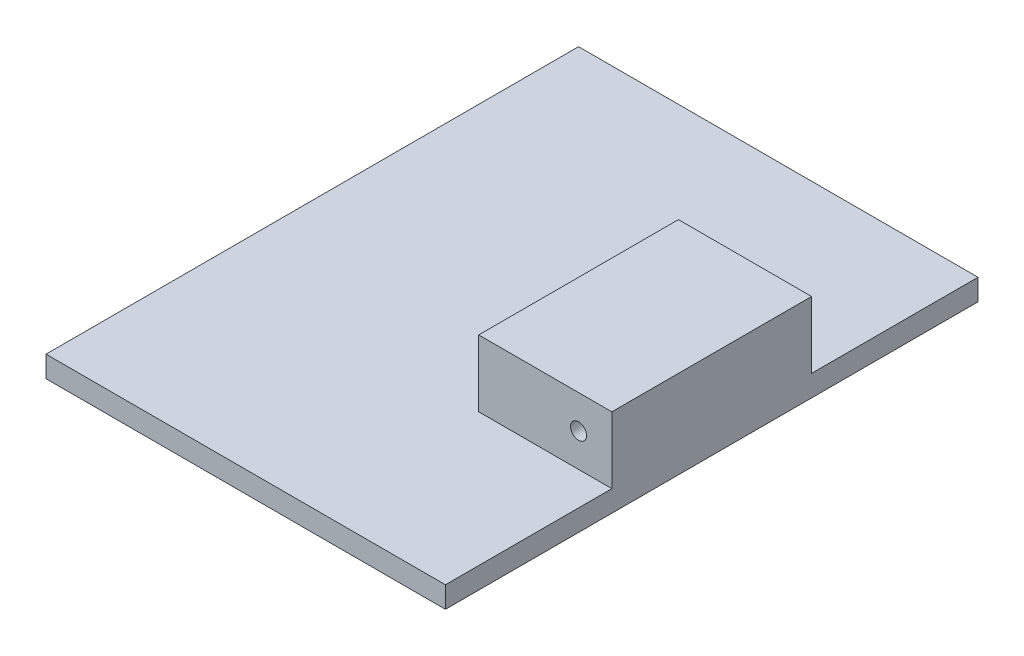
ISO-10303-21;
HEADER;
FILE_DESCRIPTION(('STEP AP214'),'2;1');
FILE_NAME('part.step','',(''),(''),'','','');
FILE_SCHEMA(('AUTOMOTIVE_DESIGN { 1 0 10303 214 1 1 1 1 }'));
ENDSEC;
DATA;
#1=APPLICATION_CONTEXT('core data for automotive mechanical design processes');
#2=APPLICATION_PROTOCOL_DEFINITION('international standard','automotive_design',2000,#1);
#3=PRODUCT_CONTEXT('',#1,'mechanical');
#4=PRODUCT('Part','Part','',(#3));
#5=PRODUCT_RELATED_PRODUCT_CATEGORY('part','',(#4));
#6=PRODUCT_DEFINITION_FORMATION('','',#4);
#7=PRODUCT_DEFINITION_CONTEXT('part definition',#1,'design');
#8=PRODUCT_DEFINITION('design','',#6,#7);
#9=PRODUCT_DEFINITION_SHAPE('','',#8);
#10=(LENGTH_UNIT() NAMED_UNIT(*) SI_UNIT(.MILLI.,.METRE.));
#11=(NAMED_UNIT(*) PLANE_ANGLE_UNIT() SI_UNIT($,.RADIAN.));
#12=(NAMED_UNIT(*) SI_UNIT($,.STERADIAN.) SOLID_ANGLE_UNIT());
#13=UNCERTAINTY_MEASURE_WITH_UNIT(LENGTH_MEASURE(1.E-05),#10,'distance_accuracy_value','');
#14=(GEOMETRIC_REPRESENTATION_CONTEXT(3) GLOBAL_UNCERTAINTY_ASSIGNED_CONTEXT((#13)) GLOBAL_UNIT_ASSIGNED_CONTEXT((#10,
#11,#12)) REPRESENTATION_CONTEXT('',''));
#15=CARTESIAN_POINT('',(0.,0.,0.));
#16=DIRECTION('',(0.,0.,1.));
#17=DIRECTION('',(1.,0.,0.));
#18=AXIS2_PLACEMENT_3D('',#15,#16,#17);
#19=CARTESIAN_POINT('',(-150.,16.,200.));
#20=DIRECTION('',(0.,0.,-1.));
#21=DIRECTION('',(-1.,0.,0.));
#22=AXIS2_PLACEMENT_3D('',#19,#20,#21);
#23=PLANE('',#22);
#24=DIRECTION('',(1.,0.,0.));
#25=VECTOR('',#24,1.);
#26=CARTESIAN_POINT('',(-150.,0.,200.));
#27=LINE('',#26,#25);
#28=CARTESIAN_POINT('',(-150.,0.,200.));
#29=VERTEX_POINT('',#28);
#30=CARTESIAN_POINT('',(150.,0.,200.));
#31=VERTEX_POINT('',#30);
#32=EDGE_CURVE('E127',#29,#31,#27,.T.);
#33=ORIENTED_EDGE('',*,*,#32,.T.);
#34=DIRECTION('',(0.,-1.,0.));
#35=VECTOR('',#34,1.);
#36=CARTESIAN_POINT('',(150.,16.,200.));
#37=LINE('',#36,#35);
#38=CARTESIAN_POINT('',(150.,16.,200.));
#39=VERTEX_POINT('',#38);
#40=EDGE_CURVE('E11',#39,#31,#37,.T.);
#41=ORIENTED_EDGE('',*,*,#40,.F.);
#42=DIRECTION('',(1.,0.,0.));
#43=VECTOR('',#42,1.);
#44=CARTESIAN_POINT('',(-150.,16.,200.));
#45=LINE('',#44,#43);
#46=CARTESIAN_POINT('',(-150.,16.,200.));
#47=VERTEX_POINT('',#46);
#48=EDGE_CURVE('E136',#47,#39,#45,.T.);
#49=ORIENTED_EDGE('',*,*,#48,.F.);
#50=DIRECTION('',(0.,-1.,0.));
#51=VECTOR('',#50,1.);
#52=CARTESIAN_POINT('',(-150.,16.,200.));
#53=LINE('',#52,#51);
#54=EDGE_CURVE('E147',#47,#29,#53,.T.);
#55=ORIENTED_EDGE('',*,*,#54,.T.);
#56=EDGE_LOOP('',(#33,#41,#49,#55));
#57=FACE_BOUND('',#56,.T.);
#58=ADVANCED_FACE('F39',(#57),#23,.F.);
#59=CARTESIAN_POINT('',(150.,16.,200.));
#60=DIRECTION('',(-1.,0.,0.));
#61=DIRECTION('',(0.,0.,1.));
#62=AXIS2_PLACEMENT_3D('',#59,#60,#61);
#63=PLANE('',#62);
#64=DIRECTION('',(0.,0.,-1.));
#65=VECTOR('',#64,1.);
#66=CARTESIAN_POINT('',(150.,0.,200.));
#67=LINE('',#66,#65);
#68=CARTESIAN_POINT('',(150.,0.,-200.));
#69=VERTEX_POINT('',#68);
#70=EDGE_CURVE('E130',#31,#69,#67,.T.);
#71=ORIENTED_EDGE('',*,*,#70,.T.);
#72=DIRECTION('',(0.,-1.,0.));
#73=VECTOR('',#72,1.);
#74=CARTESIAN_POINT('',(150.,16.,-200.));
#75=LINE('',#74,#73);
#76=CARTESIAN_POINT('',(150.,16.,-200.));
#77=VERTEX_POINT('',#76);
#78=EDGE_CURVE('E47',#77,#69,#75,.T.);
#79=ORIENTED_EDGE('',*,*,#78,.F.);
#80=DIRECTION('',(0.,0.,-1.));
#81=VECTOR('',#80,1.);
#82=CARTESIAN_POINT('',(150.,16.,200.));
#83=LINE('',#82,#81);
#84=CARTESIAN_POINT('',(150.,16.,-75.));
#85=VERTEX_POINT('',#84);
#86=EDGE_CURVE('E126',#85,#77,#83,.T.);
#87=ORIENTED_EDGE('',*,*,#86,.F.);
#88=DIRECTION('',(0.,-1.,0.));
#89=VECTOR('',#88,1.);
#90=CARTESIAN_POINT('',(150.,66.,-75.));
#91=LINE('',#90,#89);
#92=CARTESIAN_POINT('',(150.,66.,-75.));
#93=VERTEX_POINT('',#92);
#94=EDGE_CURVE('E107',#93,#85,#91,.T.);
#95=ORIENTED_EDGE('',*,*,#94,.F.);
#96=DIRECTION('',(0.,0.,-1.));
#97=VECTOR('',#96,1.);
#98=CARTESIAN_POINT('',(150.,66.,-75.));
#99=LINE('',#98,#97);
#100=CARTESIAN_POINT('',(150.,66.,75.));
#101=VERTEX_POINT('',#100);
#102=EDGE_CURVE('E113',#101,#93,#99,.T.);
#103=ORIENTED_EDGE('',*,*,#102,.F.);
#104=DIRECTION('',(0.,-1.,0.));
#105=VECTOR('',#104,1.);
#106=CARTESIAN_POINT('',(150.,66.,75.));
#107=LINE('',#106,#105);
#108=CARTESIAN_POINT('',(150.,16.,75.));
#109=VERTEX_POINT('',#108);
#110=EDGE_CURVE('E217',#101,#109,#107,.T.);
#111=ORIENTED_EDGE('',*,*,#110,.T.);
#112=EDGE_CURVE('E140',#39,#109,#83,.T.);
#113=ORIENTED_EDGE('',*,*,#112,.F.);
#114=ORIENTED_EDGE('',*,*,#40,.T.);
#115=EDGE_LOOP('',(#71,#79,#87,#95,#103,#111,#113,#114));
#116=FACE_BOUND('',#115,.T.);
#117=ADVANCED_FACE('F124',(#116),#63,.F.);
#118=CARTESIAN_POINT('',(-150.,16.,-200.));
#119=DIRECTION('',(0.,0.,-1.));
#120=DIRECTION('',(-1.,0.,0.));
#121=AXIS2_PLACEMENT_3D('',#118,#119,#120);
#122=PLANE('',#121);
#123=DIRECTION('',(1.,0.,0.));
#124=VECTOR('',#123,1.);
#125=CARTESIAN_POINT('',(-150.,0.,-200.));
#126=LINE('',#125,#124);
#127=CARTESIAN_POINT('',(-150.,0.,-200.));
#128=VERTEX_POINT('',#127);
#129=EDGE_CURVE('E150',#128,#69,#126,.T.);
#130=ORIENTED_EDGE('',*,*,#129,.F.);
#131=DIRECTION('',(0.,-1.,0.));
#132=VECTOR('',#131,1.);
#133=CARTESIAN_POINT('',(-150.,16.,-200.));
#134=LINE('',#133,#132);
#135=CARTESIAN_POINT('',(-150.,16.,-200.));
#136=VERTEX_POINT('',#135);
#137=EDGE_CURVE('E156',#136,#128,#134,.T.);
#138=ORIENTED_EDGE('',*,*,#137,.F.);
#139=DIRECTION('',(1.,0.,0.));
#140=VECTOR('',#139,1.);
#141=CARTESIAN_POINT('',(-150.,16.,-200.));
#142=LINE('',#141,#140);
#143=EDGE_CURVE('E142',#136,#77,#142,.T.);
#144=ORIENTED_EDGE('',*,*,#143,.T.);
#145=ORIENTED_EDGE('',*,*,#78,.T.);
#146=EDGE_LOOP('',(#130,#138,#144,#145));
#147=FACE_BOUND('',#146,.T.);
#148=ADVANCED_FACE('F160',(#147),#122,.T.);
#149=CARTESIAN_POINT('',(-150.,16.,200.));
#150=DIRECTION('',(-1.,0.,0.));
#151=DIRECTION('',(0.,0.,1.));
#152=AXIS2_PLACEMENT_3D('',#149,#150,#151);
#153=PLANE('',#152);
#154=DIRECTION('',(0.,0.,-1.));
#155=VECTOR('',#154,1.);
#156=CARTESIAN_POINT('',(-150.,0.,200.));
#157=LINE('',#156,#155);
#158=EDGE_CURVE('E139',#29,#128,#157,.T.);
#159=ORIENTED_EDGE('',*,*,#158,.F.);
#160=ORIENTED_EDGE('',*,*,#54,.F.);
#161=DIRECTION('',(0.,0.,-1.));
#162=VECTOR('',#161,1.);
#163=CARTESIAN_POINT('',(-150.,16.,200.));
#164=LINE('',#163,#162);
#165=EDGE_CURVE('E145',#47,#136,#164,.T.);
#166=ORIENTED_EDGE('',*,*,#165,.T.);
#167=ORIENTED_EDGE('',*,*,#137,.T.);
#168=EDGE_LOOP('',(#159,#160,#166,#167));
#169=FACE_BOUND('',#168,.T.);
#170=ADVANCED_FACE('F168',(#169),#153,.T.);
#171=CARTESIAN_POINT('',(0.,16.,0.));
#172=DIRECTION('',(0.,1.,0.));
#173=DIRECTION('',(0.,0.,1.));
#174=AXIS2_PLACEMENT_3D('',#171,#172,#173);
#175=PLANE('',#174);
#176=DIRECTION('',(1.,0.,0.));
#177=VECTOR('',#176,1.);
#178=CARTESIAN_POINT('',(50.,16.,75.));
#179=LINE('',#178,#177);
#180=CARTESIAN_POINT('',(50.,16.,75.));
#181=VERTEX_POINT('',#180);
#182=EDGE_CURVE('E54',#181,#109,#179,.T.);
#183=ORIENTED_EDGE('',*,*,#182,.F.);
#184=DIRECTION('',(0.,0.,1.));
#185=VECTOR('',#184,1.);
#186=CARTESIAN_POINT('',(50.,16.,-75.));
#187=LINE('',#186,#185);
#188=CARTESIAN_POINT('',(50.,16.,-75.));
#189=VERTEX_POINT('',#188);
#190=EDGE_CURVE('E213',#189,#181,#187,.T.);
#191=ORIENTED_EDGE('',*,*,#190,.F.);
#192=DIRECTION('',(-1.,0.,0.));
#193=VECTOR('',#192,1.);
#194=CARTESIAN_POINT('',(50.,16.,-75.));
#195=LINE('',#194,#193);
#196=EDGE_CURVE('E60',#85,#189,#195,.T.);
#197=ORIENTED_EDGE('',*,*,#196,.F.);
#198=ORIENTED_EDGE('',*,*,#86,.T.);
#199=ORIENTED_EDGE('',*,*,#143,.F.);
#200=ORIENTED_EDGE('',*,*,#165,.F.);
#201=ORIENTED_EDGE('',*,*,#48,.T.);
#202=ORIENTED_EDGE('',*,*,#112,.T.);
#203=EDGE_LOOP('',(#183,#191,#197,#198,#199,#200,#201,#202));
#204=FACE_BOUND('',#203,.T.);
#205=ADVANCED_FACE('F171',(#204),#175,.T.);
#206=CARTESIAN_POINT('',(0.,0.,0.));
#207=DIRECTION('',(0.,1.,0.));
#208=DIRECTION('',(0.,0.,1.));
#209=AXIS2_PLACEMENT_3D('',#206,#207,#208);
#210=PLANE('',#209);
#211=ORIENTED_EDGE('',*,*,#32,.F.);
#212=ORIENTED_EDGE('',*,*,#158,.T.);
#213=ORIENTED_EDGE('',*,*,#129,.T.);
#214=ORIENTED_EDGE('',*,*,#70,.F.);
#215=EDGE_LOOP('',(#211,#212,#213,#214));
#216=FACE_BOUND('',#215,.T.);
#217=ADVANCED_FACE('F165',(#216),#210,.F.);
#218=CARTESIAN_POINT('',(50.,66.,-75.));
#219=DIRECTION('',(0.,0.,1.));
#220=DIRECTION('',(1.,0.,0.));
#221=AXIS2_PLACEMENT_3D('',#218,#219,#220);
#222=PLANE('',#221);
#223=CARTESIAN_POINT('',(125.,41.,-75.));
#224=DIRECTION('',(0.,0.,1.));
#225=DIRECTION('',(1.,0.,0.));
#226=AXIS2_PLACEMENT_3D('',#223,#224,#225);
#227=CIRCLE('',#226,6.);
#228=CARTESIAN_POINT('',(131.,41.,-75.));
#229=VERTEX_POINT('',#228);
#230=EDGE_CURVE('E211',#229,#229,#227,.T.);
#231=ORIENTED_EDGE('',*,*,#230,.T.);
#232=EDGE_LOOP('',(#231));
#233=FACE_BOUND('',#232,.T.);
#234=ORIENTED_EDGE('',*,*,#196,.T.);
#235=DIRECTION('',(0.,-1.,0.));
#236=VECTOR('',#235,1.);
#237=CARTESIAN_POINT('',(50.,66.,-75.));
#238=LINE('',#237,#236);
#239=CARTESIAN_POINT('',(50.,66.,-75.));
#240=VERTEX_POINT('',#239);
#241=EDGE_CURVE('E109',#240,#189,#238,.T.);
#242=ORIENTED_EDGE('',*,*,#241,.F.);
#243=DIRECTION('',(-1.,0.,0.));
#244=VECTOR('',#243,1.);
#245=CARTESIAN_POINT('',(50.,66.,-75.));
#246=LINE('',#245,#244);
#247=EDGE_CURVE('E103',#93,#240,#246,.T.);
#248=ORIENTED_EDGE('',*,*,#247,.F.);
#249=ORIENTED_EDGE('',*,*,#94,.T.);
#250=EDGE_LOOP('',(#234,#242,#248,#249));
#251=FACE_BOUND('',#250,.T.);
#252=ADVANCED_FACE('F105',(#233,#251),#222,.F.);
#253=CARTESIAN_POINT('',(50.,66.,-75.));
#254=DIRECTION('',(1.,0.,0.));
#255=DIRECTION('',(0.,0.,-1.));
#256=AXIS2_PLACEMENT_3D('',#253,#254,#255);
#257=PLANE('',#256);
#258=ORIENTED_EDGE('',*,*,#190,.T.);
#259=DIRECTION('',(0.,-1.,0.));
#260=VECTOR('',#259,1.);
#261=CARTESIAN_POINT('',(50.,66.,75.));
#262=LINE('',#261,#260);
#263=CARTESIAN_POINT('',(50.,66.,75.));
#264=VERTEX_POINT('',#263);
#265=EDGE_CURVE('E132',#264,#181,#262,.T.);
#266=ORIENTED_EDGE('',*,*,#265,.F.);
#267=DIRECTION('',(0.,0.,1.));
#268=VECTOR('',#267,1.);
#269=CARTESIAN_POINT('',(50.,66.,-75.));
#270=LINE('',#269,#268);
#271=EDGE_CURVE('E112',#240,#264,#270,.T.);
#272=ORIENTED_EDGE('',*,*,#271,.F.);
#273=ORIENTED_EDGE('',*,*,#241,.T.);
#274=EDGE_LOOP('',(#258,#266,#272,#273));
#275=FACE_BOUND('',#274,.T.);
#276=ADVANCED_FACE('F190',(#275),#257,.F.);
#277=CARTESIAN_POINT('',(50.,66.,75.));
#278=DIRECTION('',(0.,0.,-1.));
#279=DIRECTION('',(-1.,0.,0.));
#280=AXIS2_PLACEMENT_3D('',#277,#278,#279);
#281=PLANE('',#280);
#282=CARTESIAN_POINT('',(125.,41.,75.));
#283=DIRECTION('',(0.,0.,-1.));
#284=DIRECTION('',(-1.,0.,0.));
#285=AXIS2_PLACEMENT_3D('',#282,#283,#284);
#286=CIRCLE('',#285,6.);
#287=CARTESIAN_POINT('',(119.,41.,75.));
#288=VERTEX_POINT('',#287);
#289=EDGE_CURVE('E42',#288,#288,#286,.T.);
#290=ORIENTED_EDGE('',*,*,#289,.T.);
#291=EDGE_LOOP('',(#290));
#292=FACE_BOUND('',#291,.T.);
#293=ORIENTED_EDGE('',*,*,#182,.T.);
#294=ORIENTED_EDGE('',*,*,#110,.F.);
#295=DIRECTION('',(1.,0.,0.));
#296=VECTOR('',#295,1.);
#297=CARTESIAN_POINT('',(50.,66.,75.));
#298=LINE('',#297,#296);
#299=EDGE_CURVE('E118',#264,#101,#298,.T.);
#300=ORIENTED_EDGE('',*,*,#299,.F.);
#301=ORIENTED_EDGE('',*,*,#265,.T.);
#302=EDGE_LOOP('',(#293,#294,#300,#301));
#303=FACE_BOUND('',#302,.T.);
#304=ADVANCED_FACE('F194',(#292,#303),#281,.F.);
#305=CARTESIAN_POINT('',(0.,66.,0.));
#306=DIRECTION('',(0.,1.,0.));
#307=DIRECTION('',(0.,0.,1.));
#308=AXIS2_PLACEMENT_3D('',#305,#306,#307);
#309=PLANE('',#308);
#310=ORIENTED_EDGE('',*,*,#102,.T.);
#311=ORIENTED_EDGE('',*,*,#247,.T.);
#312=ORIENTED_EDGE('',*,*,#271,.T.);
#313=ORIENTED_EDGE('',*,*,#299,.T.);
#314=EDGE_LOOP('',(#310,#311,#312,#313));
#315=FACE_BOUND('',#314,.T.);
#316=ADVANCED_FACE('F116',(#315),#309,.T.);
#317=CARTESIAN_POINT('',(125.,41.,200.));
#318=DIRECTION('',(0.,0.,-1.));
#319=DIRECTION('',(-1.,0.,0.));
#320=AXIS2_PLACEMENT_3D('',#317,#318,#319);
#321=CYLINDRICAL_SURFACE('',#320,6.);
#322=ORIENTED_EDGE('',*,*,#289,.F.);
#323=EDGE_LOOP('',(#322));
#324=FACE_BOUND('',#323,.T.);
#325=ORIENTED_EDGE('',*,*,#230,.F.);
#326=EDGE_LOOP('',(#325));
#327=FACE_BOUND('',#326,.T.);
#328=ADVANCED_FACE('F201',(#324,#327),#321,.F.);
#329=CLOSED_SHELL('',(#58,#117,#148,#170,#205,#217,#252,#276,#304,#316,#328));
#330=MANIFOLD_SOLID_BREP('B2',#329);
#331=ADVANCED_BREP_SHAPE_REPRESENTATION('',(#18,#330),#14);
#332=SHAPE_DEFINITION_REPRESENTATION(#9,#331);
ENDSEC;
END-ISO-10303-21;
